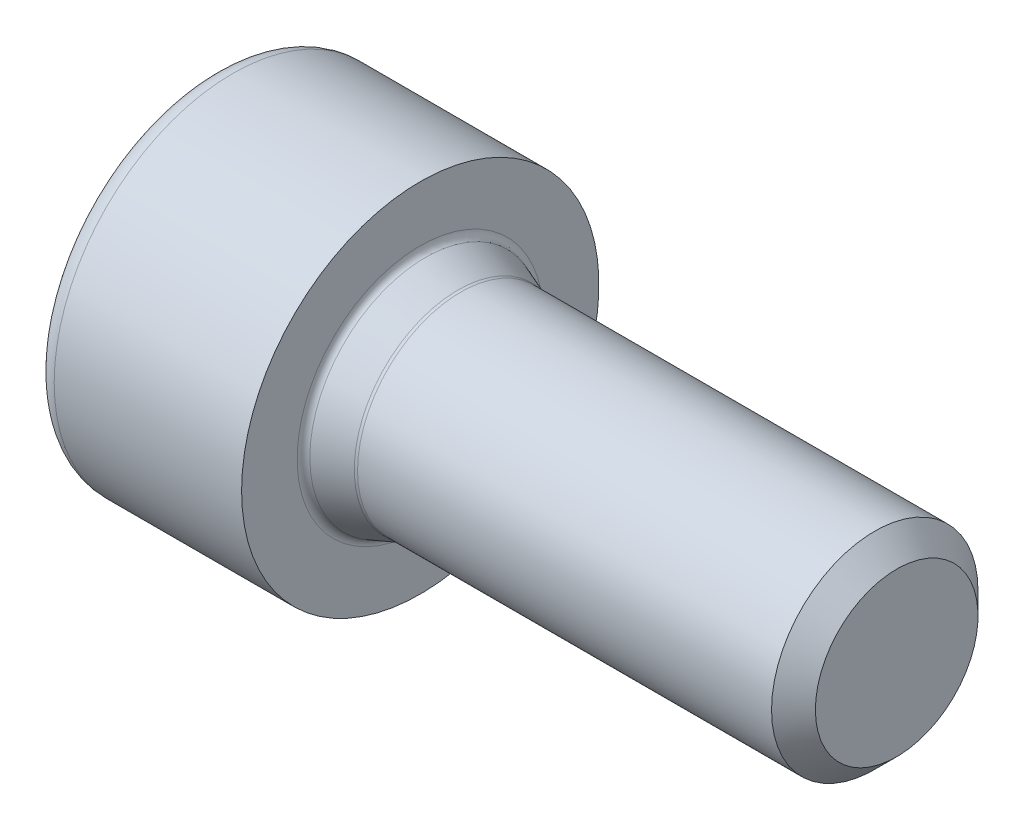
ISO-10303-21;
HEADER;
FILE_DESCRIPTION(('STEP AP214'),'2;1');
FILE_NAME('part.step','',(''),(''),'','','');
FILE_SCHEMA(('AUTOMOTIVE_DESIGN { 1 0 10303 214 1 1 1 1 }'));
ENDSEC;
DATA;
#1=APPLICATION_CONTEXT('core data for automotive mechanical design processes');
#2=APPLICATION_PROTOCOL_DEFINITION('international standard','automotive_design',2000,#1);
#3=PRODUCT_CONTEXT('',#1,'mechanical');
#4=PRODUCT('Part','Part','',(#3));
#5=PRODUCT_RELATED_PRODUCT_CATEGORY('part','',(#4));
#6=PRODUCT_DEFINITION_FORMATION('','',#4);
#7=PRODUCT_DEFINITION_CONTEXT('part definition',#1,'design');
#8=PRODUCT_DEFINITION('design','',#6,#7);
#9=PRODUCT_DEFINITION_SHAPE('','',#8);
#10=(LENGTH_UNIT() NAMED_UNIT(*) SI_UNIT(.MILLI.,.METRE.));
#11=(NAMED_UNIT(*) PLANE_ANGLE_UNIT() SI_UNIT($,.RADIAN.));
#12=(NAMED_UNIT(*) SI_UNIT($,.STERADIAN.) SOLID_ANGLE_UNIT());
#13=UNCERTAINTY_MEASURE_WITH_UNIT(LENGTH_MEASURE(1.E-05),#10,'distance_accuracy_value','');
#14=(GEOMETRIC_REPRESENTATION_CONTEXT(3) GLOBAL_UNCERTAINTY_ASSIGNED_CONTEXT((#13)) GLOBAL_UNIT_ASSIGNED_CONTEXT((#10,
#11,#12)) REPRESENTATION_CONTEXT('',''));
#15=CARTESIAN_POINT('',(0.,0.,0.));
#16=DIRECTION('',(0.,0.,1.));
#17=DIRECTION('',(1.,0.,0.));
#18=AXIS2_PLACEMENT_3D('',#15,#16,#17);
#19=CARTESIAN_POINT('',(-1.40000000295953,0.,0.));
#20=DIRECTION('',(-1.,0.,0.));
#21=DIRECTION('',(0.,0.,1.));
#22=AXIS2_PLACEMENT_3D('',#19,#20,#21);
#23=CONICAL_SURFACE('',#22,0.999999998291368,1.04719755119991);
#24=CARTESIAN_POINT('',(-0.822649734760872,0.,-1.11022302462516E-13));
#25=VERTEX_POINT('',#24);
#26=VERTEX_LOOP('',#25);
#27=FACE_BOUND('',#26,.T.);
#28=CARTESIAN_POINT('',(-1.40000000295953,0.,0.));
#29=DIRECTION('',(-1.,0.,0.));
#30=DIRECTION('',(0.,0.,1.));
#31=AXIS2_PLACEMENT_3D('',#28,#29,#30);
#32=CIRCLE('',#31,0.999999998291368);
#33=CARTESIAN_POINT('',(-1.40000000147977,0.,-0.999999999145684));
#34=VERTEX_POINT('',#33);
#35=CARTESIAN_POINT('',(-1.40000000147977,-0.866025403044579,-0.499999999572841));
#36=VERTEX_POINT('',#35);
#37=EDGE_CURVE('E108',#34,#36,#32,.T.);
#38=ORIENTED_EDGE('',*,*,#37,.T.);
#39=CARTESIAN_POINT('',(-1.40000000295953,0.,0.));
#40=DIRECTION('',(-1.,0.,0.));
#41=DIRECTION('',(0.,0.,1.));
#42=AXIS2_PLACEMENT_3D('',#39,#40,#41);
#43=CIRCLE('',#42,0.999999998291368);
#44=CARTESIAN_POINT('',(-1.40000000147977,-0.866025403044579,0.499999999572841));
#45=VERTEX_POINT('',#44);
#46=EDGE_CURVE('E110',#36,#45,#43,.T.);
#47=ORIENTED_EDGE('',*,*,#46,.T.);
#48=CARTESIAN_POINT('',(-1.40000000295953,0.,0.));
#49=DIRECTION('',(-1.,0.,0.));
#50=DIRECTION('',(0.,0.,1.));
#51=AXIS2_PLACEMENT_3D('',#48,#49,#50);
#52=CIRCLE('',#51,0.999999998291368);
#53=CARTESIAN_POINT('',(-1.40000000147977,0.,0.999999999145684));
#54=VERTEX_POINT('',#53);
#55=EDGE_CURVE('E182',#45,#54,#52,.T.);
#56=ORIENTED_EDGE('',*,*,#55,.T.);
#57=CARTESIAN_POINT('',(-1.40000000295953,0.,0.));
#58=DIRECTION('',(-1.,0.,0.));
#59=DIRECTION('',(0.,0.,1.));
#60=AXIS2_PLACEMENT_3D('',#57,#58,#59);
#61=CIRCLE('',#60,0.999999998291368);
#62=CARTESIAN_POINT('',(-1.40000000147977,0.866025403044579,0.499999999572841));
#63=VERTEX_POINT('',#62);
#64=EDGE_CURVE('E101',#54,#63,#61,.T.);
#65=ORIENTED_EDGE('',*,*,#64,.T.);
#66=CARTESIAN_POINT('',(-1.40000000295953,0.,0.));
#67=DIRECTION('',(-1.,0.,0.));
#68=DIRECTION('',(0.,0.,1.));
#69=AXIS2_PLACEMENT_3D('',#66,#67,#68);
#70=CIRCLE('',#69,0.999999998291368);
#71=CARTESIAN_POINT('',(-1.40000000147977,0.866025403044579,-0.499999999572842));
#72=VERTEX_POINT('',#71);
#73=EDGE_CURVE('E19',#63,#72,#70,.T.);
#74=ORIENTED_EDGE('',*,*,#73,.T.);
#75=CARTESIAN_POINT('',(-1.40000000295953,0.,0.));
#76=DIRECTION('',(-1.,0.,0.));
#77=DIRECTION('',(0.,0.,1.));
#78=AXIS2_PLACEMENT_3D('',#75,#76,#77);
#79=CIRCLE('',#78,0.999999998291368);
#80=EDGE_CURVE('E113',#72,#34,#79,.T.);
#81=ORIENTED_EDGE('',*,*,#80,.T.);
#82=EDGE_LOOP('',(#38,#47,#56,#65,#74,#81));
#83=FACE_BOUND('',#82,.T.);
#84=ADVANCED_FACE('F16',(#27,#83),#23,.F.);
#85=CARTESIAN_POINT('',(-1.4,0.,0.));
#86=DIRECTION('',(1.,0.,0.));
#87=DIRECTION('',(0.,0.,-1.));
#88=AXIS2_PLACEMENT_3D('',#85,#86,#87);
#89=PLANE('',#88);
#90=DIRECTION('',(0.,0.5,0.866025403784439));
#91=VECTOR('',#90,1.);
#92=CARTESIAN_POINT('',(-1.4,0.577350269189626,-1.));
#93=LINE('',#92,#91);
#94=CARTESIAN_POINT('',(-1.4,1.15470053837925,0.));
#95=VERTEX_POINT('',#94);
#96=EDGE_CURVE('E161',#95,#72,#93,.F.);
#97=ORIENTED_EDGE('',*,*,#96,.T.);
#98=ORIENTED_EDGE('',*,*,#73,.F.);
#99=DIRECTION('',(0.,-0.5,0.866025403784439));
#100=VECTOR('',#99,1.);
#101=CARTESIAN_POINT('',(-1.4,1.15470053837925,0.));
#102=LINE('',#101,#100);
#103=EDGE_CURVE('E178',#63,#95,#102,.F.);
#104=ORIENTED_EDGE('',*,*,#103,.T.);
#105=EDGE_LOOP('',(#97,#98,#104));
#106=FACE_BOUND('',#105,.T.);
#107=ADVANCED_FACE('F106',(#106),#89,.F.);
#108=CARTESIAN_POINT('',(-1.4,0.,0.));
#109=DIRECTION('',(1.,0.,0.));
#110=DIRECTION('',(0.,0.,-1.));
#111=AXIS2_PLACEMENT_3D('',#108,#109,#110);
#112=PLANE('',#111);
#113=DIRECTION('',(0.,1.,0.));
#114=VECTOR('',#113,1.);
#115=CARTESIAN_POINT('',(-1.4,-0.577350269189626,-1.));
#116=LINE('',#115,#114);
#117=CARTESIAN_POINT('',(-1.4,0.577350269189626,-1.));
#118=VERTEX_POINT('',#117);
#119=EDGE_CURVE('E146',#118,#34,#116,.F.);
#120=ORIENTED_EDGE('',*,*,#119,.T.);
#121=ORIENTED_EDGE('',*,*,#80,.F.);
#122=DIRECTION('',(0.,0.5,0.866025403784439));
#123=VECTOR('',#122,1.);
#124=CARTESIAN_POINT('',(-1.4,0.577350269189626,-1.));
#125=LINE('',#124,#123);
#126=EDGE_CURVE('E166',#72,#118,#125,.F.);
#127=ORIENTED_EDGE('',*,*,#126,.T.);
#128=EDGE_LOOP('',(#120,#121,#127));
#129=FACE_BOUND('',#128,.T.);
#130=ADVANCED_FACE('F664',(#129),#112,.F.);
#131=CARTESIAN_POINT('',(-1.4,0.,0.));
#132=DIRECTION('',(1.,0.,0.));
#133=DIRECTION('',(0.,0.,-1.));
#134=AXIS2_PLACEMENT_3D('',#131,#132,#133);
#135=PLANE('',#134);
#136=DIRECTION('',(0.,0.5,-0.866025403784439));
#137=VECTOR('',#136,1.);
#138=CARTESIAN_POINT('',(-1.4,-1.15470053837925,0.));
#139=LINE('',#138,#137);
#140=CARTESIAN_POINT('',(-1.4,-0.577350269189625,-1.));
#141=VERTEX_POINT('',#140);
#142=EDGE_CURVE('E131',#141,#36,#139,.F.);
#143=ORIENTED_EDGE('',*,*,#142,.T.);
#144=ORIENTED_EDGE('',*,*,#37,.F.);
#145=DIRECTION('',(0.,1.,0.));
#146=VECTOR('',#145,1.);
#147=CARTESIAN_POINT('',(-1.4,-0.577350269189626,-1.));
#148=LINE('',#147,#146);
#149=EDGE_CURVE('E134',#34,#141,#148,.F.);
#150=ORIENTED_EDGE('',*,*,#149,.T.);
#151=EDGE_LOOP('',(#143,#144,#150));
#152=FACE_BOUND('',#151,.T.);
#153=ADVANCED_FACE('F132',(#152),#135,.F.);
#154=CARTESIAN_POINT('',(-1.4,0.,0.));
#155=DIRECTION('',(1.,0.,0.));
#156=DIRECTION('',(0.,0.,-1.));
#157=AXIS2_PLACEMENT_3D('',#154,#155,#156);
#158=PLANE('',#157);
#159=DIRECTION('',(0.,-0.5,-0.866025403784439));
#160=VECTOR('',#159,1.);
#161=CARTESIAN_POINT('',(-1.4,-0.577350269189626,1.));
#162=LINE('',#161,#160);
#163=CARTESIAN_POINT('',(-1.4,-1.15470053837925,0.));
#164=VERTEX_POINT('',#163);
#165=EDGE_CURVE('E127',#164,#45,#162,.F.);
#166=ORIENTED_EDGE('',*,*,#165,.T.);
#167=ORIENTED_EDGE('',*,*,#46,.F.);
#168=DIRECTION('',(0.,0.5,-0.866025403784439));
#169=VECTOR('',#168,1.);
#170=CARTESIAN_POINT('',(-1.4,-1.15470053837925,0.));
#171=LINE('',#170,#169);
#172=EDGE_CURVE('E124',#36,#164,#171,.F.);
#173=ORIENTED_EDGE('',*,*,#172,.T.);
#174=EDGE_LOOP('',(#166,#167,#173));
#175=FACE_BOUND('',#174,.T.);
#176=ADVANCED_FACE('F122',(#175),#158,.F.);
#177=CARTESIAN_POINT('',(-1.4,0.,0.));
#178=DIRECTION('',(1.,0.,0.));
#179=DIRECTION('',(0.,0.,-1.));
#180=AXIS2_PLACEMENT_3D('',#177,#178,#179);
#181=PLANE('',#180);
#182=DIRECTION('',(0.,-0.5,0.866025403784439));
#183=VECTOR('',#182,1.);
#184=CARTESIAN_POINT('',(-1.4,1.15470053837925,0.));
#185=LINE('',#184,#183);
#186=CARTESIAN_POINT('',(-1.4,0.577350269189626,1.));
#187=VERTEX_POINT('',#186);
#188=EDGE_CURVE('E170',#187,#63,#185,.F.);
#189=ORIENTED_EDGE('',*,*,#188,.T.);
#190=ORIENTED_EDGE('',*,*,#64,.F.);
#191=DIRECTION('',(0.,1.,0.));
#192=VECTOR('',#191,1.);
#193=CARTESIAN_POINT('',(-1.4,0.577350269189626,1.));
#194=LINE('',#193,#192);
#195=EDGE_CURVE('E345',#54,#187,#194,.T.);
#196=ORIENTED_EDGE('',*,*,#195,.T.);
#197=EDGE_LOOP('',(#189,#190,#196));
#198=FACE_BOUND('',#197,.T.);
#199=ADVANCED_FACE('F639',(#198),#181,.F.);
#200=CARTESIAN_POINT('',(-1.4,0.,0.));
#201=DIRECTION('',(1.,0.,0.));
#202=DIRECTION('',(0.,0.,-1.));
#203=AXIS2_PLACEMENT_3D('',#200,#201,#202);
#204=PLANE('',#203);
#205=DIRECTION('',(0.,1.,0.));
#206=VECTOR('',#205,1.);
#207=CARTESIAN_POINT('',(-1.4,0.577350269189626,1.));
#208=LINE('',#207,#206);
#209=CARTESIAN_POINT('',(-1.4,-0.577350269189626,1.));
#210=VERTEX_POINT('',#209);
#211=EDGE_CURVE('E232',#210,#54,#208,.T.);
#212=ORIENTED_EDGE('',*,*,#211,.T.);
#213=ORIENTED_EDGE('',*,*,#55,.F.);
#214=DIRECTION('',(0.,-0.5,-0.866025403784439));
#215=VECTOR('',#214,1.);
#216=CARTESIAN_POINT('',(-1.4,-0.577350269189626,1.));
#217=LINE('',#216,#215);
#218=EDGE_CURVE('E138',#45,#210,#217,.F.);
#219=ORIENTED_EDGE('',*,*,#218,.T.);
#220=EDGE_LOOP('',(#212,#213,#219));
#221=FACE_BOUND('',#220,.T.);
#222=ADVANCED_FACE('F631',(#221),#204,.F.);
#223=CARTESIAN_POINT('',(-2.60999999994738,0.,0.));
#224=DIRECTION('',(-1.,0.,0.));
#225=DIRECTION('',(0.,0.,1.));
#226=AXIS2_PLACEMENT_3D('',#223,#224,#225);
#227=CONICAL_SURFACE('',#226,1.14999999999554,0.785398163397448);
#228=CARTESIAN_POINT('',(-2.60999999995904,1.14997082108174,0.00819211066471579));
#229=CARTESIAN_POINT('',(-2.59069569794109,1.13040790970147,0.0420760671193265));
#230=CARTESIAN_POINT('',(-2.57254728562539,1.11052080874663,0.0765215363883508));
#231=CARTESIAN_POINT('',(-2.53935792737307,1.06998529538578,0.146731105040229));
#232=CARTESIAN_POINT('',(-2.52433479011492,1.04933326974703,0.182501462725757));
#233=CARTESIAN_POINT('',(-2.49862379533512,1.00769267394084,0.254625090319528));
#234=CARTESIAN_POINT('',(-2.48787320858074,0.986714066412074,0.290961104431393));
#235=CARTESIAN_POINT('',(-2.47133254229926,0.944309185231465,0.36440851312513));
#236=CARTESIAN_POINT('',(-2.46553063714026,0.922884104842389,0.401517840915257));
#237=CARTESIAN_POINT('',(-2.46028770922218,0.885722031139594,0.465884440683118));
#238=CARTESIAN_POINT('',(-2.45954223965976,0.870029612838961,0.493064506473437));
#239=CARTESIAN_POINT('',(-2.46100260402094,0.838677709073708,0.547367596708866));
#240=CARTESIAN_POINT('',(-2.46320912397085,0.823018232111627,0.574490606427145));
#241=CARTESIAN_POINT('',(-2.4741085203905,0.776268628963161,0.65546329431397));
#242=CARTESIAN_POINT('',(-2.48708211250454,0.745414072925053,0.708904953016953));
#243=CARTESIAN_POINT('',(-2.51775179983956,0.692231475355554,0.801019914085815));
#244=CARTESIAN_POINT('',(-2.53360244070591,0.669614322494837,0.840193971963128));
#245=CARTESIAN_POINT('',(-2.56918983246552,0.625234496973178,0.917062084597683));
#246=CARTESIAN_POINT('',(-2.58891370161177,0.603469271176542,0.954760561515667));
#247=CARTESIAN_POINT('',(-2.60999999995904,0.58207998648713,0.991807889335283));
#248=B_SPLINE_CURVE_WITH_KNOTS('',3,(#228,#229,#230,#231,#232,#233,#234,#235,#236,#237,#238,
#239,#240,#241,#242,#243,#244,#245,#246,#247),.UNSPECIFIED.,.F.,.F.,(4,2,2,2,2,2,2,2,2,4),(0.,
0.130974113093042,0.262675260110466,0.392364226419072,0.521742405821041,0.61578672136853,
0.70985289610014,0.898025147096537,1.04164372792367,1.18479250760285),.UNSPECIFIED.);
#249=CARTESIAN_POINT('',(-2.60999999995321,1.14997082107584,0.00819211067493997));
#250=VERTEX_POINT('',#249);
#251=CARTESIAN_POINT('',(-2.60999999995321,0.582079986493034,0.991807889325058));
#252=VERTEX_POINT('',#251);
#253=EDGE_CURVE('E181',#250,#252,#248,.T.);
#254=ORIENTED_EDGE('',*,*,#253,.T.);
#255=CARTESIAN_POINT('',(-2.60999999994738,0.,0.));
#256=DIRECTION('',(-1.,0.,0.));
#257=DIRECTION('',(0.,0.,1.));
#258=AXIS2_PLACEMENT_3D('',#255,#256,#257);
#259=CIRCLE('',#258,1.14999999999554);
#260=EDGE_CURVE('E219',#252,#250,#259,.T.);
#261=ORIENTED_EDGE('',*,*,#260,.T.);
#262=EDGE_LOOP('',(#254,#261));
#263=FACE_BOUND('',#262,.T.);
#264=ADVANCED_FACE('F385',(#263),#227,.F.);
#265=CARTESIAN_POINT('',(-3.6,1.15470053837925,0.));
#266=DIRECTION('',(0.,0.866025403784439,0.5));
#267=DIRECTION('',(0.,-0.5,0.866025403784439));
#268=AXIS2_PLACEMENT_3D('',#265,#266,#267);
#269=PLANE('',#268);
#270=DIRECTION('',(1.,0.,0.));
#271=VECTOR('',#270,1.);
#272=CARTESIAN_POINT('',(-3.6,0.577350269189626,1.));
#273=LINE('',#272,#271);
#274=CARTESIAN_POINT('',(-2.61,0.577350269189626,1.));
#275=VERTEX_POINT('',#274);
#276=EDGE_CURVE('E326',#187,#275,#273,.F.);
#277=ORIENTED_EDGE('',*,*,#276,.T.);
#278=DIRECTION('',(0.,0.500000000000051,-0.866025403784409));
#279=VECTOR('',#278,1.);
#280=CARTESIAN_POINT('',(-2.61,0.577350269189626,1.));
#281=LINE('',#280,#279);
#282=EDGE_CURVE('E222',#275,#252,#281,.T.);
#283=ORIENTED_EDGE('',*,*,#282,.T.);
#284=ORIENTED_EDGE('',*,*,#253,.F.);
#285=DIRECTION('',(0.,0.499999999999925,-0.866025403784482));
#286=VECTOR('',#285,1.);
#287=CARTESIAN_POINT('',(-2.61,1.14997082107445,0.00819211067735288));
#288=LINE('',#287,#286);
#289=CARTESIAN_POINT('',(-2.61,1.15470053837925,0.));
#290=VERTEX_POINT('',#289);
#291=EDGE_CURVE('E221',#250,#290,#288,.T.);
#292=ORIENTED_EDGE('',*,*,#291,.T.);
#293=DIRECTION('',(1.,0.,0.));
#294=VECTOR('',#293,1.);
#295=CARTESIAN_POINT('',(-3.6,1.15470053837925,0.));
#296=LINE('',#295,#294);
#297=EDGE_CURVE('E175',#290,#95,#296,.T.);
#298=ORIENTED_EDGE('',*,*,#297,.T.);
#299=ORIENTED_EDGE('',*,*,#103,.F.);
#300=ORIENTED_EDGE('',*,*,#188,.F.);
#301=EDGE_LOOP('',(#277,#283,#284,#292,#298,#299,#300));
#302=FACE_BOUND('',#301,.T.);
#303=ADVANCED_FACE('F388',(#302),#269,.F.);
#304=CARTESIAN_POINT('',(-2.60999999994738,0.,0.));
#305=DIRECTION('',(-1.,0.,0.));
#306=DIRECTION('',(0.,0.,1.));
#307=AXIS2_PLACEMENT_3D('',#304,#305,#306);
#308=CONICAL_SURFACE('',#307,1.14999999999554,0.785398163397448);
#309=CARTESIAN_POINT('',(-2.60999999995904,0.582079986487132,-0.991807889335283));
#310=CARTESIAN_POINT('',(-2.59069569794109,0.601642897867411,-0.957923932880672));
#311=CARTESIAN_POINT('',(-2.57254728562539,0.621529998822245,-0.923478463611648));
#312=CARTESIAN_POINT('',(-2.53935792737307,0.662065512183095,-0.853268894959769));
#313=CARTESIAN_POINT('',(-2.52433479011493,0.682717537821843,-0.817498537274241));
#314=CARTESIAN_POINT('',(-2.49862379533512,0.724358133628039,-0.745374909680471));
#315=CARTESIAN_POINT('',(-2.48787320858074,0.745336741156802,-0.709038895568607));
#316=CARTESIAN_POINT('',(-2.47133254229926,0.787741622337411,-0.63559148687487));
#317=CARTESIAN_POINT('',(-2.46553063714026,0.809166702726487,-0.598482159084742));
#318=CARTESIAN_POINT('',(-2.46028770922218,0.846328776429282,-0.534115559316882));
#319=CARTESIAN_POINT('',(-2.45954223965976,0.862021194729915,-0.506935493526563));
#320=CARTESIAN_POINT('',(-2.46100260402094,0.893373098495168,-0.452632403291134));
#321=CARTESIAN_POINT('',(-2.46320912397085,0.909032575457249,-0.425509393572855));
#322=CARTESIAN_POINT('',(-2.4741085203905,0.955782178605715,-0.34453670568603));
#323=CARTESIAN_POINT('',(-2.48708211250454,0.986636734643823,-0.291095046983046));
#324=CARTESIAN_POINT('',(-2.51775179983956,1.03981933221332,-0.198980085914185));
#325=CARTESIAN_POINT('',(-2.53360244070591,1.06243648507404,-0.159806028036872));
#326=CARTESIAN_POINT('',(-2.56918983246552,1.1068163105957,-0.0829379154023169));
#327=CARTESIAN_POINT('',(-2.58891370161177,1.12858153639233,-0.0452394384843331));
#328=CARTESIAN_POINT('',(-2.60999999995904,1.14997082108175,-0.00819211066471684));
#329=B_SPLINE_CURVE_WITH_KNOTS('',3,(#309,#310,#311,#312,#313,#314,#315,#316,#317,#318,#319,
#320,#321,#322,#323,#324,#325,#326,#327,#328),.UNSPECIFIED.,.F.,.F.,(4,2,2,2,2,2,2,2,2,4),(0.,
0.130974113093042,0.262675260110466,0.39236422641907,0.52174240582104,0.615786721368529,
0.709852896100139,0.898025147096536,1.04164372792367,1.18479250760285),.UNSPECIFIED.);
#330=CARTESIAN_POINT('',(-2.60999999995321,0.582079986493035,-0.991807889325058));
#331=VERTEX_POINT('',#330);
#332=CARTESIAN_POINT('',(-2.60999999995321,1.14997082107584,-0.00819211067494034));
#333=VERTEX_POINT('',#332);
#334=EDGE_CURVE('E169',#331,#333,#329,.T.);
#335=ORIENTED_EDGE('',*,*,#334,.T.);
#336=CARTESIAN_POINT('',(-2.60999999994738,0.,0.));
#337=DIRECTION('',(-1.,0.,0.));
#338=DIRECTION('',(0.,0.,1.));
#339=AXIS2_PLACEMENT_3D('',#336,#337,#338);
#340=CIRCLE('',#339,1.14999999999554);
#341=EDGE_CURVE('E215',#333,#331,#340,.T.);
#342=ORIENTED_EDGE('',*,*,#341,.T.);
#343=EDGE_LOOP('',(#335,#342));
#344=FACE_BOUND('',#343,.T.);
#345=ADVANCED_FACE('F391',(#344),#308,.F.);
#346=CARTESIAN_POINT('',(-3.6,0.577350269189626,-1.));
#347=DIRECTION('',(0.,0.866025403784439,-0.5));
#348=DIRECTION('',(0.,0.5,0.866025403784439));
#349=AXIS2_PLACEMENT_3D('',#346,#347,#348);
#350=PLANE('',#349);
#351=ORIENTED_EDGE('',*,*,#297,.F.);
#352=DIRECTION('',(0.,-0.499999999999935,-0.866025403784476));
#353=VECTOR('',#352,1.);
#354=CARTESIAN_POINT('',(-2.61,1.15470053837925,0.));
#355=LINE('',#354,#353);
#356=EDGE_CURVE('E218',#290,#333,#355,.T.);
#357=ORIENTED_EDGE('',*,*,#356,.T.);
#358=ORIENTED_EDGE('',*,*,#334,.F.);
#359=DIRECTION('',(0.,-0.500000000000001,-0.866025403784438));
#360=VECTOR('',#359,1.);
#361=CARTESIAN_POINT('',(-2.61,0.582079986494427,-0.991807889322647));
#362=LINE('',#361,#360);
#363=CARTESIAN_POINT('',(-2.61,0.577350269189626,-1.));
#364=VERTEX_POINT('',#363);
#365=EDGE_CURVE('E217',#331,#364,#362,.T.);
#366=ORIENTED_EDGE('',*,*,#365,.T.);
#367=DIRECTION('',(-1.,0.,0.));
#368=VECTOR('',#367,1.);
#369=CARTESIAN_POINT('',(-3.6,0.577350269189626,-1.));
#370=LINE('',#369,#368);
#371=EDGE_CURVE('E149',#364,#118,#370,.F.);
#372=ORIENTED_EDGE('',*,*,#371,.T.);
#373=ORIENTED_EDGE('',*,*,#126,.F.);
#374=ORIENTED_EDGE('',*,*,#96,.F.);
#375=EDGE_LOOP('',(#351,#357,#358,#366,#372,#373,#374));
#376=FACE_BOUND('',#375,.T.);
#377=ADVANCED_FACE('F395',(#376),#350,.F.);
#378=CARTESIAN_POINT('',(-2.60999999994738,0.,0.));
#379=DIRECTION('',(-1.,0.,0.));
#380=DIRECTION('',(0.,0.,1.));
#381=AXIS2_PLACEMENT_3D('',#378,#379,#380);
#382=CONICAL_SURFACE('',#381,1.14999999999554,0.785398163585767);
#383=CARTESIAN_POINT('',(-2.60999999995904,-0.567890834594616,-1.));
#384=CARTESIAN_POINT('',(-2.59069569794201,-0.528765011821204,-1.));
#385=CARTESIAN_POINT('',(-2.57254728562775,-0.488990809898605,-1.));
#386=CARTESIAN_POINT('',(-2.53935792737974,-0.407919783151053,-1.));
#387=CARTESIAN_POINT('',(-2.52433479012446,-0.366615731860636,-1.));
#388=CARTESIAN_POINT('',(-2.49862379535211,-0.283334540223058,-1.));
#389=CARTESIAN_POINT('',(-2.48787320860227,-0.24137732515327,-1.));
#390=CARTESIAN_POINT('',(-2.47133254233148,-0.156567562768132,-1.));
#391=CARTESIAN_POINT('',(-2.46553063717862,-0.11371740197832,-1.));
#392=CARTESIAN_POINT('',(-2.46028770927158,-0.0393932545456865,-1.));
#393=CARTESIAN_POINT('',(-2.4595422397145,-0.00800841792877835,-1.));
#394=CARTESIAN_POINT('',(-2.46100260408811,0.0546953896324318,-1.));
#395=CARTESIAN_POINT('',(-2.4632091240451,0.0860143435716535,-1.));
#396=CARTESIAN_POINT('',(-2.47410852048782,0.179513549912728,-1.));
#397=CARTESIAN_POINT('',(-2.4870821126197,0.241222662016971,-1.));
#398=CARTESIAN_POINT('',(-2.51775179996441,0.347587857124209,-1.));
#399=CARTESIAN_POINT('',(-2.53360244081348,0.392822162789088,-1.));
#400=CARTESIAN_POINT('',(-2.56918983252678,0.481581813723888,-1.));
#401=CARTESIAN_POINT('',(-2.58891370164401,0.525112265265193,-1.));
#402=CARTESIAN_POINT('',(-2.60999999995904,0.567890834594616,-1.));
#403=B_SPLINE_CURVE_WITH_KNOTS('',3,(#383,#384,#385,#386,#387,#388,#389,#390,#391,#392,#393,
#394,#395,#396,#397,#398,#399,#400,#401,#402),.UNSPECIFIED.,.F.,.F.,(4,2,2,2,2,2,2,2,2,4),(0.,
0.130974113126446,0.262675260177285,0.392364226518035,0.521742405952123,0.615786721546037,
0.70985289632413,0.898025147413555,1.04164372806448,1.18479250756705),.UNSPECIFIED.);
#404=CARTESIAN_POINT('',(-2.60999999995321,-0.567890834582809,-1.));
#405=VERTEX_POINT('',#404);
#406=CARTESIAN_POINT('',(-2.60999999995321,0.567890834582809,-1.));
#407=VERTEX_POINT('',#406);
#408=EDGE_CURVE('E160',#405,#407,#403,.T.);
#409=ORIENTED_EDGE('',*,*,#408,.T.);
#410=CARTESIAN_POINT('',(-2.60999999994738,0.,0.));
#411=DIRECTION('',(-1.,0.,0.));
#412=DIRECTION('',(0.,0.,1.));
#413=AXIS2_PLACEMENT_3D('',#410,#411,#412);
#414=CIRCLE('',#413,1.14999999999554);
#415=EDGE_CURVE('E211',#407,#405,#414,.T.);
#416=ORIENTED_EDGE('',*,*,#415,.T.);
#417=EDGE_LOOP('',(#409,#416));
#418=FACE_BOUND('',#417,.T.);
#419=ADVANCED_FACE('F400',(#418),#382,.F.);
#420=CARTESIAN_POINT('',(-3.6,-0.577350269189626,-1.));
#421=DIRECTION('',(0.,0.,-1.));
#422=DIRECTION('',(-1.,0.,0.));
#423=AXIS2_PLACEMENT_3D('',#420,#421,#422);
#424=PLANE('',#423);
#425=ORIENTED_EDGE('',*,*,#371,.F.);
#426=DIRECTION('',(0.,1.,0.));
#427=VECTOR('',#426,1.);
#428=CARTESIAN_POINT('',(-2.61,0.,-1.));
#429=LINE('',#428,#427);
#430=EDGE_CURVE('E214',#364,#407,#429,.F.);
#431=ORIENTED_EDGE('',*,*,#430,.T.);
#432=ORIENTED_EDGE('',*,*,#408,.F.);
#433=DIRECTION('',(0.,1.,0.));
#434=VECTOR('',#433,1.);
#435=CARTESIAN_POINT('',(-2.61,0.,-1.));
#436=LINE('',#435,#434);
#437=CARTESIAN_POINT('',(-2.61,-0.577350269189626,-1.));
#438=VERTEX_POINT('',#437);
#439=EDGE_CURVE('E213',#405,#438,#436,.F.);
#440=ORIENTED_EDGE('',*,*,#439,.T.);
#441=DIRECTION('',(1.,0.,0.));
#442=VECTOR('',#441,1.);
#443=CARTESIAN_POINT('',(-3.6,-0.577350269189625,-1.));
#444=LINE('',#443,#442);
#445=EDGE_CURVE('E139',#438,#141,#444,.T.);
#446=ORIENTED_EDGE('',*,*,#445,.T.);
#447=ORIENTED_EDGE('',*,*,#149,.F.);
#448=ORIENTED_EDGE('',*,*,#119,.F.);
#449=EDGE_LOOP('',(#425,#431,#432,#440,#446,#447,#448));
#450=FACE_BOUND('',#449,.T.);
#451=ADVANCED_FACE('F405',(#450),#424,.F.);
#452=CARTESIAN_POINT('',(-2.60999999994738,0.,0.));
#453=DIRECTION('',(-1.,0.,0.));
#454=DIRECTION('',(0.,0.,1.));
#455=AXIS2_PLACEMENT_3D('',#452,#453,#454);
#456=CONICAL_SURFACE('',#455,1.14999999999554,0.785398163397448);
#457=CARTESIAN_POINT('',(-2.60999999995904,-1.14997082108174,-0.00819211066471576));
#458=CARTESIAN_POINT('',(-2.59069569794109,-1.13040790970147,-0.0420760671193267));
#459=CARTESIAN_POINT('',(-2.57254728562539,-1.11052080874663,-0.0765215363883511));
#460=CARTESIAN_POINT('',(-2.53935792737307,-1.06998529538578,-0.14673110504023));
#461=CARTESIAN_POINT('',(-2.52433479011492,-1.04933326974703,-0.182501462725758));
#462=CARTESIAN_POINT('',(-2.49862379533512,-1.00769267394084,-0.254625090319528));
#463=CARTESIAN_POINT('',(-2.48787320858074,-0.986714066412074,-0.290961104431393));
#464=CARTESIAN_POINT('',(-2.47133254229926,-0.944309185231465,-0.36440851312513));
#465=CARTESIAN_POINT('',(-2.46553063714026,-0.922884104842389,-0.401517840915257));
#466=CARTESIAN_POINT('',(-2.46028770922218,-0.885722031139594,-0.465884440683118));
#467=CARTESIAN_POINT('',(-2.45954223965976,-0.870029612838961,-0.493064506473437));
#468=CARTESIAN_POINT('',(-2.46100260402094,-0.838677709073708,-0.547367596708866));
#469=CARTESIAN_POINT('',(-2.46320912397085,-0.823018232111627,-0.574490606427145));
#470=CARTESIAN_POINT('',(-2.4741085203905,-0.776268628963161,-0.655463294313969));
#471=CARTESIAN_POINT('',(-2.48708211250454,-0.745414072925053,-0.708904953016953));
#472=CARTESIAN_POINT('',(-2.51775179983956,-0.692231475355554,-0.801019914085815));
#473=CARTESIAN_POINT('',(-2.53360244070591,-0.669614322494838,-0.840193971963128));
#474=CARTESIAN_POINT('',(-2.56918983246552,-0.625234496973178,-0.917062084597683));
#475=CARTESIAN_POINT('',(-2.58891370161177,-0.603469271176542,-0.954760561515667));
#476=CARTESIAN_POINT('',(-2.60999999995904,-0.58207998648713,-0.991807889335283));
#477=B_SPLINE_CURVE_WITH_KNOTS('',3,(#457,#458,#459,#460,#461,#462,#463,#464,#465,#466,#467,
#468,#469,#470,#471,#472,#473,#474,#475,#476),.UNSPECIFIED.,.F.,.F.,(4,2,2,2,2,2,2,2,2,4),(0.,
0.130974113093043,0.262675260110467,0.392364226419072,0.521742405821041,0.61578672136853,
0.70985289610014,0.898025147096537,1.04164372792367,1.18479250760285),.UNSPECIFIED.);
#478=CARTESIAN_POINT('',(-2.60999999995321,-1.14997082107584,-0.00819211067493996));
#479=VERTEX_POINT('',#478);
#480=CARTESIAN_POINT('',(-2.60999999995321,-0.582079986493034,-0.991807889325058));
#481=VERTEX_POINT('',#480);
#482=EDGE_CURVE('E145',#479,#481,#477,.T.);
#483=ORIENTED_EDGE('',*,*,#482,.T.);
#484=CARTESIAN_POINT('',(-2.60999999994738,0.,0.));
#485=DIRECTION('',(-1.,0.,0.));
#486=DIRECTION('',(0.,0.,1.));
#487=AXIS2_PLACEMENT_3D('',#484,#485,#486);
#488=CIRCLE('',#487,1.14999999999554);
#489=EDGE_CURVE('E207',#481,#479,#488,.T.);
#490=ORIENTED_EDGE('',*,*,#489,.T.);
#491=EDGE_LOOP('',(#483,#490));
#492=FACE_BOUND('',#491,.T.);
#493=ADVANCED_FACE('F418',(#492),#456,.F.);
#494=CARTESIAN_POINT('',(-3.6,-1.15470053837925,0.));
#495=DIRECTION('',(0.,-0.866025403784439,-0.5));
#496=DIRECTION('',(0.,0.5,-0.866025403784439));
#497=AXIS2_PLACEMENT_3D('',#494,#495,#496);
#498=PLANE('',#497);
#499=ORIENTED_EDGE('',*,*,#445,.F.);
#500=DIRECTION('',(0.,-0.500000000000051,0.866025403784409));
#501=VECTOR('',#500,1.);
#502=CARTESIAN_POINT('',(-2.61,-0.577350269189626,-1.));
#503=LINE('',#502,#501);
#504=EDGE_CURVE('E210',#438,#481,#503,.T.);
#505=ORIENTED_EDGE('',*,*,#504,.T.);
#506=ORIENTED_EDGE('',*,*,#482,.F.);
#507=DIRECTION('',(0.,-0.499999999999925,0.866025403784482));
#508=VECTOR('',#507,1.);
#509=CARTESIAN_POINT('',(-2.61,-1.14997082107445,-0.00819211067735288));
#510=LINE('',#509,#508);
#511=CARTESIAN_POINT('',(-2.61,-1.15470053837925,0.));
#512=VERTEX_POINT('',#511);
#513=EDGE_CURVE('E209',#479,#512,#510,.T.);
#514=ORIENTED_EDGE('',*,*,#513,.T.);
#515=DIRECTION('',(1.,0.,0.));
#516=VECTOR('',#515,1.);
#517=CARTESIAN_POINT('',(-3.6,-1.15470053837925,0.));
#518=LINE('',#517,#516);
#519=EDGE_CURVE('E144',#512,#164,#518,.T.);
#520=ORIENTED_EDGE('',*,*,#519,.T.);
#521=ORIENTED_EDGE('',*,*,#172,.F.);
#522=ORIENTED_EDGE('',*,*,#142,.F.);
#523=EDGE_LOOP('',(#499,#505,#506,#514,#520,#521,#522));
#524=FACE_BOUND('',#523,.T.);
#525=ADVANCED_FACE('F141',(#524),#498,.F.);
#526=CARTESIAN_POINT('',(-2.60999999994738,0.,0.));
#527=DIRECTION('',(-1.,0.,0.));
#528=DIRECTION('',(0.,0.,1.));
#529=AXIS2_PLACEMENT_3D('',#526,#527,#528);
#530=CONICAL_SURFACE('',#529,1.14999999999554,0.785398163397448);
#531=CARTESIAN_POINT('',(-2.60999999995904,-0.582079986487132,0.991807889335283));
#532=CARTESIAN_POINT('',(-2.59069569794109,-0.601642897867411,0.957923932880672));
#533=CARTESIAN_POINT('',(-2.57254728562539,-0.621529998822245,0.923478463611648));
#534=CARTESIAN_POINT('',(-2.53935792737307,-0.662065512183095,0.853268894959769));
#535=CARTESIAN_POINT('',(-2.52433479011492,-0.682717537821843,0.817498537274241));
#536=CARTESIAN_POINT('',(-2.49862379533512,-0.724358133628039,0.745374909680471));
#537=CARTESIAN_POINT('',(-2.48787320858074,-0.745336741156802,0.709038895568606));
#538=CARTESIAN_POINT('',(-2.47133254229926,-0.787741622337411,0.635591486874869));
#539=CARTESIAN_POINT('',(-2.46553063714026,-0.809166702726488,0.598482159084742));
#540=CARTESIAN_POINT('',(-2.46028770922218,-0.846328776429283,0.534115559316881));
#541=CARTESIAN_POINT('',(-2.45954223965976,-0.862021194729915,0.506935493526562));
#542=CARTESIAN_POINT('',(-2.46100260402094,-0.893373098495169,0.452632403291133));
#543=CARTESIAN_POINT('',(-2.46320912397085,-0.90903257545725,0.425509393572854));
#544=CARTESIAN_POINT('',(-2.4741085203905,-0.955782178605716,0.344536705686029));
#545=CARTESIAN_POINT('',(-2.48708211250454,-0.986636734643824,0.291095046983046));
#546=CARTESIAN_POINT('',(-2.51775179983956,-1.03981933221332,0.198980085914184));
#547=CARTESIAN_POINT('',(-2.53360244070591,-1.06243648507404,0.159806028036871));
#548=CARTESIAN_POINT('',(-2.56918983246552,-1.1068163105957,0.0829379154023163));
#549=CARTESIAN_POINT('',(-2.58891370161177,-1.12858153639233,0.0452394384843326));
#550=CARTESIAN_POINT('',(-2.60999999995904,-1.14997082108175,0.00819211066471674));
#551=B_SPLINE_CURVE_WITH_KNOTS('',3,(#531,#532,#533,#534,#535,#536,#537,#538,#539,#540,#541,
#542,#543,#544,#545,#546,#547,#548,#549,#550),.UNSPECIFIED.,.F.,.F.,(4,2,2,2,2,2,2,2,2,4),(0.,
0.130974113093042,0.262675260110466,0.392364226419071,0.521742405821041,0.615786721368529,
0.709852896100139,0.898025147096537,1.04164372792367,1.18479250760285),.UNSPECIFIED.);
#552=CARTESIAN_POINT('',(-2.60999999995321,-0.582079986493035,0.991807889325059));
#553=VERTEX_POINT('',#552);
#554=CARTESIAN_POINT('',(-2.60999999995321,-1.14997082107584,0.00819211067494031));
#555=VERTEX_POINT('',#554);
#556=EDGE_CURVE('E233',#553,#555,#551,.T.);
#557=ORIENTED_EDGE('',*,*,#556,.T.);
#558=CARTESIAN_POINT('',(-2.60999999994738,0.,0.));
#559=DIRECTION('',(-1.,0.,0.));
#560=DIRECTION('',(0.,0.,1.));
#561=AXIS2_PLACEMENT_3D('',#558,#559,#560);
#562=CIRCLE('',#561,1.14999999999554);
#563=EDGE_CURVE('E203',#555,#553,#562,.T.);
#564=ORIENTED_EDGE('',*,*,#563,.T.);
#565=EDGE_LOOP('',(#557,#564));
#566=FACE_BOUND('',#565,.T.);
#567=ADVANCED_FACE('F422',(#566),#530,.F.);
#568=CARTESIAN_POINT('',(-3.6,-0.577350269189626,1.));
#569=DIRECTION('',(0.,-0.866025403784439,0.5));
#570=DIRECTION('',(0.,-0.5,-0.866025403784439));
#571=AXIS2_PLACEMENT_3D('',#568,#569,#570);
#572=PLANE('',#571);
#573=ORIENTED_EDGE('',*,*,#519,.F.);
#574=DIRECTION('',(0.,0.499999999999935,0.866025403784476));
#575=VECTOR('',#574,1.);
#576=CARTESIAN_POINT('',(-2.61,-1.15470053837925,0.));
#577=LINE('',#576,#575);
#578=EDGE_CURVE('E206',#512,#555,#577,.T.);
#579=ORIENTED_EDGE('',*,*,#578,.T.);
#580=ORIENTED_EDGE('',*,*,#556,.F.);
#581=DIRECTION('',(0.,0.499999999999991,0.866025403784444));
#582=VECTOR('',#581,1.);
#583=CARTESIAN_POINT('',(-2.61,-0.582079986494427,0.991807889322647));
#584=LINE('',#583,#582);
#585=CARTESIAN_POINT('',(-2.61,-0.577350269189626,1.));
#586=VERTEX_POINT('',#585);
#587=EDGE_CURVE('E205',#553,#586,#584,.T.);
#588=ORIENTED_EDGE('',*,*,#587,.T.);
#589=DIRECTION('',(1.,0.,0.));
#590=VECTOR('',#589,1.);
#591=CARTESIAN_POINT('',(-3.6,-0.577350269189626,1.));
#592=LINE('',#591,#590);
#593=EDGE_CURVE('E318',#586,#210,#592,.T.);
#594=ORIENTED_EDGE('',*,*,#593,.T.);
#595=ORIENTED_EDGE('',*,*,#218,.F.);
#596=ORIENTED_EDGE('',*,*,#165,.F.);
#597=EDGE_LOOP('',(#573,#579,#580,#588,#594,#595,#596));
#598=FACE_BOUND('',#597,.T.);
#599=ADVANCED_FACE('F425',(#598),#572,.F.);
#600=CARTESIAN_POINT('',(-3.6,0.577350269189626,1.));
#601=DIRECTION('',(0.,0.,1.));
#602=DIRECTION('',(1.,0.,0.));
#603=AXIS2_PLACEMENT_3D('',#600,#601,#602);
#604=PLANE('',#603);
#605=ORIENTED_EDGE('',*,*,#593,.F.);
#606=DIRECTION('',(0.,1.,0.));
#607=VECTOR('',#606,1.);
#608=CARTESIAN_POINT('',(-2.61,0.,1.));
#609=LINE('',#608,#607);
#610=CARTESIAN_POINT('',(-2.60999999997369,-0.567890834624285,1.));
#611=VERTEX_POINT('',#610);
#612=EDGE_CURVE('E34',#586,#611,#609,.T.);
#613=ORIENTED_EDGE('',*,*,#612,.T.);
#614=CARTESIAN_POINT('',(-2.6099999999568,-0.567890834590084,1.));
#615=CARTESIAN_POINT('',(-2.5906956979391,-0.528765011829791,1.));
#616=CARTESIAN_POINT('',(-2.57254728562364,-0.488990809920395,1.));
#617=CARTESIAN_POINT('',(-2.53935792737178,-0.407919783199266,1.));
#618=CARTESIAN_POINT('',(-2.52433479011386,-0.366615731922067,1.));
#619=CARTESIAN_POINT('',(-2.49862379533445,-0.283334540310281,1.));
#620=CARTESIAN_POINT('',(-2.48787320858023,-0.241377325253061,1.));
#621=CARTESIAN_POINT('',(-2.47133254229903,-0.156567562892474,1.));
#622=CARTESIAN_POINT('',(-2.46553063714013,-0.113717402114647,1.));
#623=CARTESIAN_POINT('',(-2.46028770922215,-0.0393932547093964,1.));
#624=CARTESIAN_POINT('',(-2.45954223965975,-0.00800841810814228,1.));
#625=CARTESIAN_POINT('',(-2.46100260402099,0.0546953894223412,1.));
#626=CARTESIAN_POINT('',(-2.46320912397093,0.0860143433464904,1.));
#627=CARTESIAN_POINT('',(-2.47410852039065,0.179513549643378,1.));
#628=CARTESIAN_POINT('',(-2.48708211250473,0.241222661719559,1.));
#629=CARTESIAN_POINT('',(-2.51775179983954,0.347587856857578,1.));
#630=CARTESIAN_POINT('',(-2.53360244070553,0.392822162578098,1.));
#631=CARTESIAN_POINT('',(-2.56918983246431,0.481581813619654,1.));
#632=CARTESIAN_POINT('',(-2.58891370161006,0.525112265212079,1.));
#633=CARTESIAN_POINT('',(-2.6099999999568,0.567890834590084,1.));
#634=B_SPLINE_CURVE_WITH_KNOTS('',3,(#614,#615,#616,#617,#618,#619,#620,#621,#622,#623,#624,
#625,#626,#627,#628,#629,#630,#631,#632,#633),.UNSPECIFIED.,.F.,.F.,(4,2,2,2,2,2,2,2,2,4),(0.,
0.130974113091999,0.262675260108358,0.392364226415951,0.521742405816918,0.615786721364373,
0.70985289609595,0.898025147092274,1.04164372791649,1.18479250759275),.UNSPECIFIED.);
#635=CARTESIAN_POINT('',(-2.60999999995209,0.567890834580543,1.));
#636=VERTEX_POINT('',#635);
#637=EDGE_CURVE('E223',#611,#636,#634,.T.);
#638=ORIENTED_EDGE('',*,*,#637,.T.);
#639=DIRECTION('',(0.,1.,0.));
#640=VECTOR('',#639,1.);
#641=CARTESIAN_POINT('',(-2.61,0.,1.));
#642=LINE('',#641,#640);
#643=EDGE_CURVE('E231',#636,#275,#642,.T.);
#644=ORIENTED_EDGE('',*,*,#643,.T.);
#645=ORIENTED_EDGE('',*,*,#276,.F.);
#646=ORIENTED_EDGE('',*,*,#195,.F.);
#647=ORIENTED_EDGE('',*,*,#211,.F.);
#648=EDGE_LOOP('',(#605,#613,#638,#644,#645,#646,#647));
#649=FACE_BOUND('',#648,.T.);
#650=ADVANCED_FACE('F240',(#649),#604,.F.);
#651=CARTESIAN_POINT('',(-2.60999999994738,0.,0.));
#652=DIRECTION('',(-1.,0.,0.));
#653=DIRECTION('',(0.,0.,1.));
#654=AXIS2_PLACEMENT_3D('',#651,#652,#653);
#655=CONICAL_SURFACE('',#654,1.14999999999554,0.785398163397448);
#656=ORIENTED_EDGE('',*,*,#637,.F.);
#657=CARTESIAN_POINT('',(-2.60999999994738,0.,0.));
#658=DIRECTION('',(-1.,0.,0.));
#659=DIRECTION('',(0.,0.,1.));
#660=AXIS2_PLACEMENT_3D('',#657,#658,#659);
#661=CIRCLE('',#660,1.14999999999554);
#662=EDGE_CURVE('E199',#611,#636,#661,.T.);
#663=ORIENTED_EDGE('',*,*,#662,.T.);
#664=EDGE_LOOP('',(#656,#663));
#665=FACE_BOUND('',#664,.T.);
#666=ADVANCED_FACE('F242',(#665),#655,.F.);
#667=CARTESIAN_POINT('',(-2.61,0.,-1.15));
#668=DIRECTION('',(1.,0.,0.));
#669=DIRECTION('',(0.,0.,-1.));
#670=AXIS2_PLACEMENT_3D('',#667,#668,#669);
#671=PLANE('',#670);
#672=ORIENTED_EDGE('',*,*,#612,.F.);
#673=ORIENTED_EDGE('',*,*,#587,.F.);
#674=ORIENTED_EDGE('',*,*,#563,.F.);
#675=ORIENTED_EDGE('',*,*,#578,.F.);
#676=ORIENTED_EDGE('',*,*,#513,.F.);
#677=ORIENTED_EDGE('',*,*,#489,.F.);
#678=ORIENTED_EDGE('',*,*,#504,.F.);
#679=ORIENTED_EDGE('',*,*,#439,.F.);
#680=ORIENTED_EDGE('',*,*,#415,.F.);
#681=ORIENTED_EDGE('',*,*,#430,.F.);
#682=ORIENTED_EDGE('',*,*,#365,.F.);
#683=ORIENTED_EDGE('',*,*,#341,.F.);
#684=ORIENTED_EDGE('',*,*,#356,.F.);
#685=ORIENTED_EDGE('',*,*,#291,.F.);
#686=ORIENTED_EDGE('',*,*,#260,.F.);
#687=ORIENTED_EDGE('',*,*,#282,.F.);
#688=ORIENTED_EDGE('',*,*,#643,.F.);
#689=ORIENTED_EDGE('',*,*,#662,.F.);
#690=EDGE_LOOP('',(#672,#673,#674,#675,#676,#677,#678,#679,#680,#681,#682,#683,#684,#685,#686,
#687,#688,#689));
#691=FACE_BOUND('',#690,.T.);
#692=CARTESIAN_POINT('',(-2.61,0.,0.));
#693=DIRECTION('',(1.,0.,0.));
#694=DIRECTION('',(0.,0.,-1.));
#695=AXIS2_PLACEMENT_3D('',#692,#693,#694);
#696=CIRCLE('',#695,2.);
#697=CARTESIAN_POINT('',(-2.61,0.,-2.));
#698=VERTEX_POINT('',#697);
#699=EDGE_CURVE('E202',#698,#698,#696,.T.);
#700=ORIENTED_EDGE('',*,*,#699,.F.);
#701=EDGE_LOOP('',(#700));
#702=FACE_BOUND('',#701,.T.);
#703=ADVANCED_FACE('F246',(#691,#702),#671,.F.);
#704=CARTESIAN_POINT('',(-2.36,0.,0.));
#705=DIRECTION('',(1.,0.,0.));
#706=DIRECTION('',(0.,0.,-1.));
#707=AXIS2_PLACEMENT_3D('',#704,#705,#706);
#708=TOROIDAL_SURFACE('',#707,2.,0.25);
#709=CARTESIAN_POINT('',(-2.36,0.,0.));
#710=DIRECTION('',(-1.,0.,0.));
#711=DIRECTION('',(0.,0.,1.));
#712=AXIS2_PLACEMENT_3D('',#709,#710,#711);
#713=CIRCLE('',#712,2.25);
#714=CARTESIAN_POINT('',(-2.36,0.,2.25));
#715=VERTEX_POINT('',#714);
#716=EDGE_CURVE('E196',#715,#715,#713,.F.);
#717=ORIENTED_EDGE('',*,*,#716,.F.);
#718=EDGE_LOOP('',(#717));
#719=FACE_BOUND('',#718,.T.);
#720=ORIENTED_EDGE('',*,*,#699,.T.);
#721=EDGE_LOOP('',(#720));
#722=FACE_BOUND('',#721,.T.);
#723=ADVANCED_FACE('F251',(#719,#722),#708,.T.);
#724=CARTESIAN_POINT('',(6.,0.,0.));
#725=DIRECTION('',(-1.,0.,0.));
#726=DIRECTION('',(0.,0.,1.));
#727=AXIS2_PLACEMENT_3D('',#724,#725,#726);
#728=CYLINDRICAL_SURFACE('',#727,2.25);
#729=ORIENTED_EDGE('',*,*,#716,.T.);
#730=EDGE_LOOP('',(#729));
#731=FACE_BOUND('',#730,.T.);
#732=CARTESIAN_POINT('',(0.,0.,0.));
#733=DIRECTION('',(-1.,0.,0.));
#734=DIRECTION('',(0.,0.,1.));
#735=AXIS2_PLACEMENT_3D('',#732,#733,#734);
#736=CIRCLE('',#735,2.25);
#737=CARTESIAN_POINT('',(0.,0.,2.25));
#738=VERTEX_POINT('',#737);
#739=EDGE_CURVE('E192',#738,#738,#736,.T.);
#740=ORIENTED_EDGE('',*,*,#739,.T.);
#741=EDGE_LOOP('',(#740));
#742=FACE_BOUND('',#741,.T.);
#743=ADVANCED_FACE('F493',(#731,#742),#728,.T.);
#744=CARTESIAN_POINT('',(0.,0.,-2.25));
#745=DIRECTION('',(-1.,0.,0.));
#746=DIRECTION('',(0.,0.,1.));
#747=AXIS2_PLACEMENT_3D('',#744,#745,#746);
#748=PLANE('',#747);
#749=ORIENTED_EDGE('',*,*,#739,.F.);
#750=EDGE_LOOP('',(#749));
#751=FACE_BOUND('',#750,.T.);
#752=CARTESIAN_POINT('',(0.,0.,0.));
#753=DIRECTION('',(1.,0.,0.));
#754=DIRECTION('',(0.,0.,-1.));
#755=AXIS2_PLACEMENT_3D('',#752,#753,#754);
#756=CIRCLE('',#755,1.55);
#757=CARTESIAN_POINT('',(0.,0.,-1.55));
#758=VERTEX_POINT('',#757);
#759=EDGE_CURVE('E195',#758,#758,#756,.F.);
#760=ORIENTED_EDGE('',*,*,#759,.T.);
#761=EDGE_LOOP('',(#760));
#762=FACE_BOUND('',#761,.T.);
#763=ADVANCED_FACE('F473',(#751,#762),#748,.F.);
#764=CARTESIAN_POINT('',(0.0999999999999995,0.,0.));
#765=DIRECTION('',(1.,0.,0.));
#766=DIRECTION('',(0.,0.,-1.));
#767=AXIS2_PLACEMENT_3D('',#764,#765,#766);
#768=TOROIDAL_SURFACE('',#767,1.55,0.1);
#769=ORIENTED_EDGE('',*,*,#759,.F.);
#770=EDGE_LOOP('',(#769));
#771=FACE_BOUND('',#770,.T.);
#772=CARTESIAN_POINT('',(0.0656418468452102,0.,0.));
#773=DIRECTION('',(-1.,0.,0.));
#774=DIRECTION('',(0.,0.,1.));
#775=AXIS2_PLACEMENT_3D('',#772,#773,#774);
#776=CIRCLE('',#775,1.45608771484262);
#777=CARTESIAN_POINT('',(0.0656418468452102,0.,1.45608771484262));
#778=VERTEX_POINT('',#777);
#779=EDGE_CURVE('E189',#778,#778,#776,.F.);
#780=ORIENTED_EDGE('',*,*,#779,.F.);
#781=EDGE_LOOP('',(#780));
#782=FACE_BOUND('',#781,.T.);
#783=ADVANCED_FACE('F467',(#771,#782),#768,.F.);
#784=CARTESIAN_POINT('',(6.,0.,-1.024));
#785=DIRECTION('',(-1.,0.,0.));
#786=DIRECTION('',(0.,0.,1.));
#787=AXIS2_PLACEMENT_3D('',#784,#785,#786);
#788=PLANE('',#787);
#789=CARTESIAN_POINT('',(6.00000000002865,0.,0.));
#790=DIRECTION('',(-1.,0.,0.));
#791=DIRECTION('',(0.,0.,1.));
#792=AXIS2_PLACEMENT_3D('',#789,#790,#791);
#793=CIRCLE('',#792,1.0239999999726);
#794=CARTESIAN_POINT('',(6.00000000002865,0.,1.0239999999726));
#795=VERTEX_POINT('',#794);
#796=EDGE_CURVE('E185',#795,#795,#793,.T.);
#797=ORIENTED_EDGE('',*,*,#796,.F.);
#798=EDGE_LOOP('',(#797));
#799=FACE_BOUND('',#798,.T.);
#800=ADVANCED_FACE('F472',(#799),#788,.F.);
#801=CARTESIAN_POINT('',(0.0656418468452102,0.,0.));
#802=DIRECTION('',(-1.,0.,0.));
#803=DIRECTION('',(0.,0.,1.));
#804=AXIS2_PLACEMENT_3D('',#801,#802,#803);
#805=CONICAL_SURFACE('',#804,1.45608771484262,0.35072794819303);
#806=ORIENTED_EDGE('',*,*,#779,.T.);
#807=EDGE_LOOP('',(#806));
#808=FACE_BOUND('',#807,.T.);
#809=CARTESIAN_POINT('',(0.475641846873645,0.,0.));
#810=DIRECTION('',(1.,0.,0.));
#811=DIRECTION('',(0.,0.,-1.));
#812=AXIS2_PLACEMENT_3D('',#809,#810,#811);
#813=CIRCLE('',#812,1.30608771478796);
#814=CARTESIAN_POINT('',(0.475641846873645,0.,-1.30608771478796));
#815=VERTEX_POINT('',#814);
#816=EDGE_CURVE('E188',#815,#815,#813,.F.);
#817=ORIENTED_EDGE('',*,*,#816,.T.);
#818=EDGE_LOOP('',(#817));
#819=FACE_BOUND('',#818,.T.);
#820=ADVANCED_FACE('F511',(#808,#819),#805,.T.);
#821=CARTESIAN_POINT('',(5.72399999998652,0.,0.));
#822=DIRECTION('',(-1.,0.,0.));
#823=DIRECTION('',(0.,0.,1.));
#824=AXIS2_PLACEMENT_3D('',#821,#822,#823);
#825=CONICAL_SURFACE('',#824,1.30000000007158,0.785398163500426);
#826=CARTESIAN_POINT('',(5.724,0.,0.));
#827=DIRECTION('',(-1.,0.,0.));
#828=DIRECTION('',(0.,0.,1.));
#829=AXIS2_PLACEMENT_3D('',#826,#827,#828);
#830=CIRCLE('',#829,1.3);
#831=CARTESIAN_POINT('',(5.724,0.,1.3));
#832=VERTEX_POINT('',#831);
#833=EDGE_CURVE('E25',#832,#832,#830,.T.);
#834=ORIENTED_EDGE('',*,*,#833,.F.);
#835=EDGE_LOOP('',(#834));
#836=FACE_BOUND('',#835,.T.);
#837=ORIENTED_EDGE('',*,*,#796,.T.);
#838=EDGE_LOOP('',(#837));
#839=FACE_BOUND('',#838,.T.);
#840=ADVANCED_FACE('F442',(#836,#839),#825,.T.);
#841=CARTESIAN_POINT('',(0.509999999999978,0.,0.));
#842=DIRECTION('',(1.,0.,0.));
#843=DIRECTION('',(0.,0.,-1.));
#844=AXIS2_PLACEMENT_3D('',#841,#842,#843);
#845=TOROIDAL_SURFACE('',#844,1.4,0.1);
#846=ORIENTED_EDGE('',*,*,#816,.F.);
#847=EDGE_LOOP('',(#846));
#848=FACE_BOUND('',#847,.T.);
#849=CARTESIAN_POINT('',(0.51,0.,0.));
#850=DIRECTION('',(-1.,0.,0.));
#851=DIRECTION('',(0.,0.,1.));
#852=AXIS2_PLACEMENT_3D('',#849,#850,#851);
#853=CIRCLE('',#852,1.3);
#854=CARTESIAN_POINT('',(0.51,0.,1.3));
#855=VERTEX_POINT('',#854);
#856=EDGE_CURVE('E10',#855,#855,#853,.F.);
#857=ORIENTED_EDGE('',*,*,#856,.F.);
#858=EDGE_LOOP('',(#857));
#859=FACE_BOUND('',#858,.T.);
#860=ADVANCED_FACE('F436',(#848,#859),#845,.F.);
#861=CARTESIAN_POINT('',(6.,0.,0.));
#862=DIRECTION('',(-1.,0.,0.));
#863=DIRECTION('',(0.,0.,1.));
#864=AXIS2_PLACEMENT_3D('',#861,#862,#863);
#865=CYLINDRICAL_SURFACE('',#864,1.3);
#866=ORIENTED_EDGE('',*,*,#856,.T.);
#867=EDGE_LOOP('',(#866));
#868=FACE_BOUND('',#867,.T.);
#869=ORIENTED_EDGE('',*,*,#833,.T.);
#870=EDGE_LOOP('',(#869));
#871=FACE_BOUND('',#870,.T.);
#872=ADVANCED_FACE('F434',(#868,#871),#865,.T.);
#873=CLOSED_SHELL('',(#84,#107,#130,#153,#176,#199,#222,#264,#303,#345,#377,#419,#451,#493,#525,
#567,#599,#650,#666,#703,#723,#743,#763,#783,#800,#820,#840,#860,#872));
#874=MANIFOLD_SOLID_BREP('B1',#873);
#875=ADVANCED_BREP_SHAPE_REPRESENTATION('',(#18,#874),#14);
#876=SHAPE_DEFINITION_REPRESENTATION(#9,#875);
ENDSEC;
END-ISO-10303-21;
